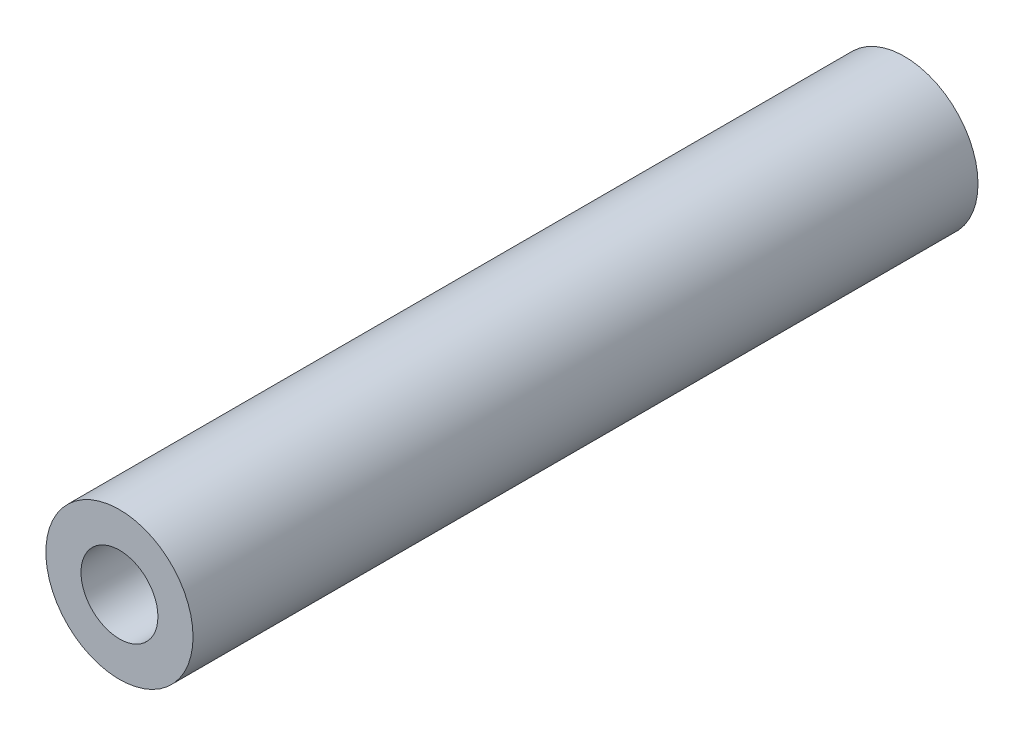
ISO-10303-21;
HEADER;
FILE_DESCRIPTION(('STEP AP214'),'2;1');
FILE_NAME('part.step','',(''),(''),'','','');
FILE_SCHEMA(('AUTOMOTIVE_DESIGN { 1 0 10303 214 1 1 1 1 }'));
ENDSEC;
DATA;
#1=APPLICATION_CONTEXT('core data for automotive mechanical design processes');
#2=APPLICATION_PROTOCOL_DEFINITION('international standard','automotive_design',2000,#1);
#3=PRODUCT_CONTEXT('',#1,'mechanical');
#4=PRODUCT('Part','Part','',(#3));
#5=PRODUCT_RELATED_PRODUCT_CATEGORY('part','',(#4));
#6=PRODUCT_DEFINITION_FORMATION('','',#4);
#7=PRODUCT_DEFINITION_CONTEXT('part definition',#1,'design');
#8=PRODUCT_DEFINITION('design','',#6,#7);
#9=PRODUCT_DEFINITION_SHAPE('','',#8);
#10=(LENGTH_UNIT() NAMED_UNIT(*) SI_UNIT(.MILLI.,.METRE.));
#11=(NAMED_UNIT(*) PLANE_ANGLE_UNIT() SI_UNIT($,.RADIAN.));
#12=(NAMED_UNIT(*) SI_UNIT($,.STERADIAN.) SOLID_ANGLE_UNIT());
#13=UNCERTAINTY_MEASURE_WITH_UNIT(LENGTH_MEASURE(1.E-05),#10,'distance_accuracy_value','');
#14=(GEOMETRIC_REPRESENTATION_CONTEXT(3) GLOBAL_UNCERTAINTY_ASSIGNED_CONTEXT((#13)) GLOBAL_UNIT_ASSIGNED_CONTEXT((#10,
#11,#12)) REPRESENTATION_CONTEXT('',''));
#15=CARTESIAN_POINT('',(0.,0.,0.));
#16=DIRECTION('',(0.,0.,1.));
#17=DIRECTION('',(1.,0.,0.));
#18=AXIS2_PLACEMENT_3D('',#15,#16,#17);
#19=CARTESIAN_POINT('',(0.,0.,25.4));
#20=DIRECTION('',(0.,0.,1.));
#21=DIRECTION('',(1.,0.,0.));
#22=AXIS2_PLACEMENT_3D('',#19,#20,#21);
#23=PLANE('',#22);
#24=CARTESIAN_POINT('',(0.,0.,25.4));
#25=DIRECTION('',(0.,0.,1.));
#26=DIRECTION('',(1.,0.,0.));
#27=AXIS2_PLACEMENT_3D('',#24,#25,#26);
#28=CIRCLE('',#27,4.7625);
#29=CARTESIAN_POINT('',(4.7625,0.,25.4));
#30=VERTEX_POINT('',#29);
#31=EDGE_CURVE('E10',#30,#30,#28,.T.);
#32=ORIENTED_EDGE('',*,*,#31,.T.);
#33=EDGE_LOOP('',(#32));
#34=FACE_BOUND('',#33,.T.);
#35=CARTESIAN_POINT('',(0.,0.,25.4));
#36=DIRECTION('',(0.,0.,1.));
#37=DIRECTION('',(1.,0.,0.));
#38=AXIS2_PLACEMENT_3D('',#35,#36,#37);
#39=CIRCLE('',#38,2.4892);
#40=CARTESIAN_POINT('',(2.4892,0.,25.4));
#41=VERTEX_POINT('',#40);
#42=EDGE_CURVE('E56',#41,#41,#39,.T.);
#43=ORIENTED_EDGE('',*,*,#42,.F.);
#44=EDGE_LOOP('',(#43));
#45=FACE_BOUND('',#44,.T.);
#46=ADVANCED_FACE('F43',(#34,#45),#23,.T.);
#47=CARTESIAN_POINT('',(0.,0.,-25.4));
#48=DIRECTION('',(0.,0.,1.));
#49=DIRECTION('',(1.,0.,0.));
#50=AXIS2_PLACEMENT_3D('',#47,#48,#49);
#51=PLANE('',#50);
#52=CARTESIAN_POINT('',(0.,0.,-25.4));
#53=DIRECTION('',(0.,0.,1.));
#54=DIRECTION('',(1.,0.,0.));
#55=AXIS2_PLACEMENT_3D('',#52,#53,#54);
#56=CIRCLE('',#55,4.7625);
#57=CARTESIAN_POINT('',(4.7625,0.,-25.4));
#58=VERTEX_POINT('',#57);
#59=EDGE_CURVE('E47',#58,#58,#56,.T.);
#60=ORIENTED_EDGE('',*,*,#59,.F.);
#61=EDGE_LOOP('',(#60));
#62=FACE_BOUND('',#61,.T.);
#63=CARTESIAN_POINT('',(0.,0.,-25.4));
#64=DIRECTION('',(0.,0.,1.));
#65=DIRECTION('',(1.,0.,0.));
#66=AXIS2_PLACEMENT_3D('',#63,#64,#65);
#67=CIRCLE('',#66,2.4892);
#68=CARTESIAN_POINT('',(2.4892,0.,-25.4));
#69=VERTEX_POINT('',#68);
#70=EDGE_CURVE('E58',#69,#69,#67,.T.);
#71=ORIENTED_EDGE('',*,*,#70,.T.);
#72=EDGE_LOOP('',(#71));
#73=FACE_BOUND('',#72,.T.);
#74=ADVANCED_FACE('F70',(#62,#73),#51,.F.);
#75=CARTESIAN_POINT('',(0.,0.,25.4));
#76=DIRECTION('',(0.,0.,-1.));
#77=DIRECTION('',(-1.,0.,0.));
#78=AXIS2_PLACEMENT_3D('',#75,#76,#77);
#79=CYLINDRICAL_SURFACE('',#78,4.7625);
#80=ORIENTED_EDGE('',*,*,#31,.F.);
#81=EDGE_LOOP('',(#80));
#82=FACE_BOUND('',#81,.T.);
#83=ORIENTED_EDGE('',*,*,#59,.T.);
#84=EDGE_LOOP('',(#83));
#85=FACE_BOUND('',#84,.T.);
#86=ADVANCED_FACE('F45',(#82,#85),#79,.T.);
#87=CARTESIAN_POINT('',(0.,0.,25.4));
#88=DIRECTION('',(0.,0.,-1.));
#89=DIRECTION('',(-1.,0.,0.));
#90=AXIS2_PLACEMENT_3D('',#87,#88,#89);
#91=CYLINDRICAL_SURFACE('',#90,2.4892);
#92=ORIENTED_EDGE('',*,*,#42,.T.);
#93=EDGE_LOOP('',(#92));
#94=FACE_BOUND('',#93,.T.);
#95=ORIENTED_EDGE('',*,*,#70,.F.);
#96=EDGE_LOOP('',(#95));
#97=FACE_BOUND('',#96,.T.);
#98=ADVANCED_FACE('F66',(#94,#97),#91,.F.);
#99=CLOSED_SHELL('',(#46,#74,#86,#98));
#100=MANIFOLD_SOLID_BREP('B2',#99);
#101=ADVANCED_BREP_SHAPE_REPRESENTATION('',(#18,#100),#14);
#102=SHAPE_DEFINITION_REPRESENTATION(#9,#101);
ENDSEC;
END-ISO-10303-21;
